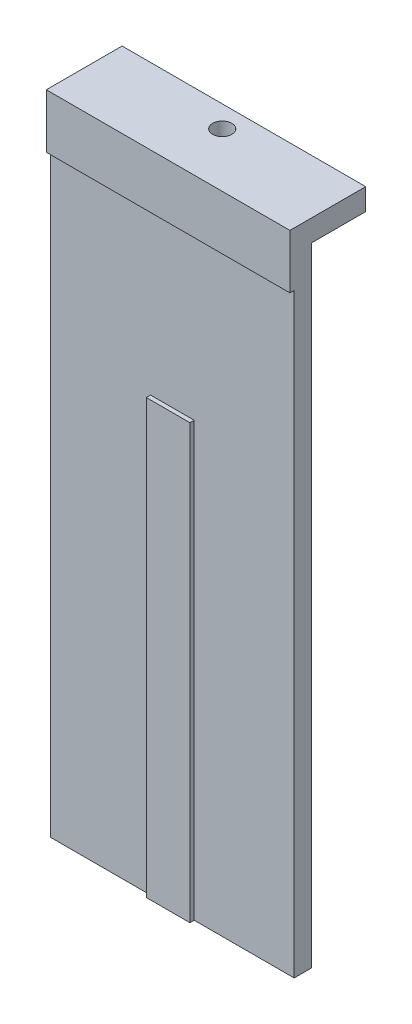
ISO-10303-21;
HEADER;
FILE_DESCRIPTION(('STEP AP214'),'2;1');
FILE_NAME('part.step','',(''),(''),'','','');
FILE_SCHEMA(('AUTOMOTIVE_DESIGN { 1 0 10303 214 1 1 1 1 }'));
ENDSEC;
DATA;
#1=APPLICATION_CONTEXT('core data for automotive mechanical design processes');
#2=APPLICATION_PROTOCOL_DEFINITION('international standard','automotive_design',2000,#1);
#3=PRODUCT_CONTEXT('',#1,'mechanical');
#4=PRODUCT('Part','Part','',(#3));
#5=PRODUCT_RELATED_PRODUCT_CATEGORY('part','',(#4));
#6=PRODUCT_DEFINITION_FORMATION('','',#4);
#7=PRODUCT_DEFINITION_CONTEXT('part definition',#1,'design');
#8=PRODUCT_DEFINITION('design','',#6,#7);
#9=PRODUCT_DEFINITION_SHAPE('','',#8);
#10=(LENGTH_UNIT() NAMED_UNIT(*) SI_UNIT(.MILLI.,.METRE.));
#11=(NAMED_UNIT(*) PLANE_ANGLE_UNIT() SI_UNIT($,.RADIAN.));
#12=(NAMED_UNIT(*) SI_UNIT($,.STERADIAN.) SOLID_ANGLE_UNIT());
#13=UNCERTAINTY_MEASURE_WITH_UNIT(LENGTH_MEASURE(1.E-05),#10,'distance_accuracy_value','');
#14=(GEOMETRIC_REPRESENTATION_CONTEXT(3) GLOBAL_UNCERTAINTY_ASSIGNED_CONTEXT((#13)) GLOBAL_UNIT_ASSIGNED_CONTEXT((#10,
#11,#12)) REPRESENTATION_CONTEXT('',''));
#15=CARTESIAN_POINT('',(0.,0.,0.));
#16=DIRECTION('',(0.,0.,1.));
#17=DIRECTION('',(1.,0.,0.));
#18=AXIS2_PLACEMENT_3D('',#15,#16,#17);
#19=CARTESIAN_POINT('',(-28.575,-152.4,2.54));
#20=DIRECTION('',(0.,0.,1.));
#21=DIRECTION('',(1.,0.,0.));
#22=AXIS2_PLACEMENT_3D('',#19,#20,#21);
#23=PLANE('',#22);
#24=DIRECTION('',(-1.,0.,0.));
#25=VECTOR('',#24,1.);
#26=CARTESIAN_POINT('',(28.575,-12.7,2.54));
#27=LINE('',#26,#25);
#28=CARTESIAN_POINT('',(28.575,-12.7,2.54));
#29=VERTEX_POINT('',#28);
#30=CARTESIAN_POINT('',(-28.575,-12.7,2.54));
#31=VERTEX_POINT('',#30);
#32=EDGE_CURVE('E177',#29,#31,#27,.T.);
#33=ORIENTED_EDGE('',*,*,#32,.F.);
#34=DIRECTION('',(0.,1.,0.));
#35=VECTOR('',#34,1.);
#36=CARTESIAN_POINT('',(28.575,-152.4,2.54));
#37=LINE('',#36,#35);
#38=CARTESIAN_POINT('',(28.575,0.,2.54));
#39=VERTEX_POINT('',#38);
#40=EDGE_CURVE('E11',#29,#39,#37,.T.);
#41=ORIENTED_EDGE('',*,*,#40,.T.);
#42=DIRECTION('',(1.,0.,0.));
#43=VECTOR('',#42,1.);
#44=CARTESIAN_POINT('',(-28.575,0.,2.54));
#45=LINE('',#44,#43);
#46=CARTESIAN_POINT('',(-28.575,0.,2.54));
#47=VERTEX_POINT('',#46);
#48=EDGE_CURVE('E234',#47,#39,#45,.T.);
#49=ORIENTED_EDGE('',*,*,#48,.F.);
#50=DIRECTION('',(0.,1.,0.));
#51=VECTOR('',#50,1.);
#52=CARTESIAN_POINT('',(-28.575,-152.4,2.54));
#53=LINE('',#52,#51);
#54=EDGE_CURVE('E53',#31,#47,#53,.T.);
#55=ORIENTED_EDGE('',*,*,#54,.F.);
#56=EDGE_LOOP('',(#33,#41,#49,#55));
#57=FACE_BOUND('',#56,.T.);
#58=ADVANCED_FACE('F43',(#57),#23,.T.);
#59=CARTESIAN_POINT('',(28.575,-152.4,2.54));
#60=DIRECTION('',(1.,0.,0.));
#61=DIRECTION('',(0.,0.,-1.));
#62=AXIS2_PLACEMENT_3D('',#59,#60,#61);
#63=PLANE('',#62);
#64=DIRECTION('',(0.,0.,1.));
#65=VECTOR('',#64,1.);
#66=CARTESIAN_POINT('',(28.575,-12.7,1.54));
#67=LINE('',#66,#65);
#68=CARTESIAN_POINT('',(28.575,-12.7,1.54));
#69=VERTEX_POINT('',#68);
#70=EDGE_CURVE('E215',#69,#29,#67,.T.);
#71=ORIENTED_EDGE('',*,*,#70,.F.);
#72=DIRECTION('',(0.,1.,0.));
#73=VECTOR('',#72,1.);
#74=CARTESIAN_POINT('',(28.575,-152.4,1.54));
#75=LINE('',#74,#73);
#76=CARTESIAN_POINT('',(28.575,-152.4,1.54));
#77=VERTEX_POINT('',#76);
#78=EDGE_CURVE('E192',#77,#69,#75,.T.);
#79=ORIENTED_EDGE('',*,*,#78,.F.);
#80=DIRECTION('',(0.,0.,-1.));
#81=VECTOR('',#80,1.);
#82=CARTESIAN_POINT('',(28.575,-152.4,2.54));
#83=LINE('',#82,#81);
#84=CARTESIAN_POINT('',(28.575,-152.4,-2.54));
#85=VERTEX_POINT('',#84);
#86=EDGE_CURVE('E230',#77,#85,#83,.T.);
#87=ORIENTED_EDGE('',*,*,#86,.T.);
#88=DIRECTION('',(0.,1.,0.));
#89=VECTOR('',#88,1.);
#90=CARTESIAN_POINT('',(28.575,-152.4,-2.54));
#91=LINE('',#90,#89);
#92=CARTESIAN_POINT('',(28.575,-5.08000000000006,-2.54));
#93=VERTEX_POINT('',#92);
#94=EDGE_CURVE('E161',#85,#93,#91,.T.);
#95=ORIENTED_EDGE('',*,*,#94,.T.);
#96=DIRECTION('',(0.,0.,1.));
#97=VECTOR('',#96,1.);
#98=CARTESIAN_POINT('',(28.575,-5.08,-15.24));
#99=LINE('',#98,#97);
#100=CARTESIAN_POINT('',(28.575,-5.08,-15.24));
#101=VERTEX_POINT('',#100);
#102=EDGE_CURVE('E141',#101,#93,#99,.T.);
#103=ORIENTED_EDGE('',*,*,#102,.F.);
#104=DIRECTION('',(0.,-1.,0.));
#105=VECTOR('',#104,1.);
#106=CARTESIAN_POINT('',(28.575,0.,-15.24));
#107=LINE('',#106,#105);
#108=CARTESIAN_POINT('',(28.575,0.,-15.24));
#109=VERTEX_POINT('',#108);
#110=EDGE_CURVE('E149',#109,#101,#107,.T.);
#111=ORIENTED_EDGE('',*,*,#110,.F.);
#112=DIRECTION('',(0.,0.,-1.));
#113=VECTOR('',#112,1.);
#114=CARTESIAN_POINT('',(28.575,0.,2.54));
#115=LINE('',#114,#113);
#116=EDGE_CURVE('E214',#39,#109,#115,.T.);
#117=ORIENTED_EDGE('',*,*,#116,.F.);
#118=ORIENTED_EDGE('',*,*,#40,.F.);
#119=EDGE_LOOP('',(#71,#79,#87,#95,#103,#111,#117,#118));
#120=FACE_BOUND('',#119,.T.);
#121=ADVANCED_FACE('F45',(#120),#63,.T.);
#122=DIRECTION('',(0.,-1.,0.));
#123=VECTOR('',#122,1.);
#124=CARTESIAN_POINT('',(5.12499999999998,-50.8,2.54));
#125=LINE('',#124,#123);
#126=CARTESIAN_POINT('',(5.12499999999998,-50.8,2.54));
#127=VERTEX_POINT('',#126);
#128=CARTESIAN_POINT('',(5.12500000000002,-152.4,2.54));
#129=VERTEX_POINT('',#128);
#130=EDGE_CURVE('E205',#127,#129,#125,.T.);
#131=ORIENTED_EDGE('',*,*,#130,.F.);
#132=DIRECTION('',(1.,0.,0.));
#133=VECTOR('',#132,1.);
#134=CARTESIAN_POINT('',(-5.12500000000002,-50.8,2.54));
#135=LINE('',#134,#133);
#136=CARTESIAN_POINT('',(-5.12500000000002,-50.8,2.54));
#137=VERTEX_POINT('',#136);
#138=EDGE_CURVE('E168',#137,#127,#135,.T.);
#139=ORIENTED_EDGE('',*,*,#138,.F.);
#140=DIRECTION('',(0.,1.,0.));
#141=VECTOR('',#140,1.);
#142=CARTESIAN_POINT('',(-5.12500000000002,-152.4,2.54));
#143=LINE('',#142,#141);
#144=CARTESIAN_POINT('',(-5.12500000000002,-152.4,2.54));
#145=VERTEX_POINT('',#144);
#146=EDGE_CURVE('E163',#145,#137,#143,.T.);
#147=ORIENTED_EDGE('',*,*,#146,.F.);
#148=DIRECTION('',(1.,0.,0.));
#149=VECTOR('',#148,1.);
#150=CARTESIAN_POINT('',(-28.575,-152.4,2.54));
#151=LINE('',#150,#149);
#152=EDGE_CURVE('E242',#145,#129,#151,.T.);
#153=ORIENTED_EDGE('',*,*,#152,.T.);
#154=EDGE_LOOP('',(#131,#139,#147,#153));
#155=FACE_BOUND('',#154,.T.);
#156=ADVANCED_FACE('F291',(#155),#23,.T.);
#157=CARTESIAN_POINT('',(-28.575,-152.4,2.54));
#158=DIRECTION('',(-1.,0.,0.));
#159=DIRECTION('',(0.,0.,1.));
#160=AXIS2_PLACEMENT_3D('',#157,#158,#159);
#161=PLANE('',#160);
#162=DIRECTION('',(0.,0.,1.));
#163=VECTOR('',#162,1.);
#164=CARTESIAN_POINT('',(-28.575,-12.7,1.54));
#165=LINE('',#164,#163);
#166=CARTESIAN_POINT('',(-28.575,-12.7,1.54));
#167=VERTEX_POINT('',#166);
#168=EDGE_CURVE('E210',#167,#31,#165,.T.);
#169=ORIENTED_EDGE('',*,*,#168,.T.);
#170=ORIENTED_EDGE('',*,*,#54,.T.);
#171=DIRECTION('',(0.,0.,1.));
#172=VECTOR('',#171,1.);
#173=CARTESIAN_POINT('',(-28.575,0.,2.54));
#174=LINE('',#173,#172);
#175=CARTESIAN_POINT('',(-28.575,0.,-15.24));
#176=VERTEX_POINT('',#175);
#177=EDGE_CURVE('E248',#176,#47,#174,.T.);
#178=ORIENTED_EDGE('',*,*,#177,.F.);
#179=DIRECTION('',(0.,1.,0.));
#180=VECTOR('',#179,1.);
#181=CARTESIAN_POINT('',(-28.575,0.,-15.24));
#182=LINE('',#181,#180);
#183=CARTESIAN_POINT('',(-28.575,-5.08,-15.24));
#184=VERTEX_POINT('',#183);
#185=EDGE_CURVE('E148',#184,#176,#182,.T.);
#186=ORIENTED_EDGE('',*,*,#185,.F.);
#187=DIRECTION('',(0.,0.,1.));
#188=VECTOR('',#187,1.);
#189=CARTESIAN_POINT('',(-28.575,-5.08,-15.24));
#190=LINE('',#189,#188);
#191=CARTESIAN_POINT('',(-28.575,-5.08,-2.54));
#192=VERTEX_POINT('',#191);
#193=EDGE_CURVE('E143',#184,#192,#190,.T.);
#194=ORIENTED_EDGE('',*,*,#193,.T.);
#195=DIRECTION('',(0.,1.,0.));
#196=VECTOR('',#195,1.);
#197=CARTESIAN_POINT('',(-28.575,-152.4,-2.54));
#198=LINE('',#197,#196);
#199=CARTESIAN_POINT('',(-28.575,-152.4,-2.54));
#200=VERTEX_POINT('',#199);
#201=EDGE_CURVE('E257',#200,#192,#198,.T.);
#202=ORIENTED_EDGE('',*,*,#201,.F.);
#203=DIRECTION('',(0.,0.,1.));
#204=VECTOR('',#203,1.);
#205=CARTESIAN_POINT('',(-28.575,-152.4,2.54));
#206=LINE('',#205,#204);
#207=CARTESIAN_POINT('',(-28.575,-152.4,1.54));
#208=VERTEX_POINT('',#207);
#209=EDGE_CURVE('E238',#200,#208,#206,.T.);
#210=ORIENTED_EDGE('',*,*,#209,.T.);
#211=DIRECTION('',(0.,-1.,0.));
#212=VECTOR('',#211,1.);
#213=CARTESIAN_POINT('',(-28.575,-12.7,1.54));
#214=LINE('',#213,#212);
#215=EDGE_CURVE('E69',#167,#208,#214,.T.);
#216=ORIENTED_EDGE('',*,*,#215,.F.);
#217=EDGE_LOOP('',(#169,#170,#178,#186,#194,#202,#210,#216));
#218=FACE_BOUND('',#217,.T.);
#219=ADVANCED_FACE('F265',(#218),#161,.T.);
#220=CARTESIAN_POINT('',(-28.575,-152.4,-2.54));
#221=DIRECTION('',(0.,0.,-1.));
#222=DIRECTION('',(-1.,0.,0.));
#223=AXIS2_PLACEMENT_3D('',#220,#221,#222);
#224=PLANE('',#223);
#225=DIRECTION('',(-1.,0.,0.));
#226=VECTOR('',#225,1.);
#227=CARTESIAN_POINT('',(28.575,-5.08,-2.54));
#228=LINE('',#227,#226);
#229=EDGE_CURVE('E61',#93,#192,#228,.T.);
#230=ORIENTED_EDGE('',*,*,#229,.F.);
#231=ORIENTED_EDGE('',*,*,#94,.F.);
#232=DIRECTION('',(-1.,0.,0.));
#233=VECTOR('',#232,1.);
#234=CARTESIAN_POINT('',(-28.575,-152.4,-2.54));
#235=LINE('',#234,#233);
#236=EDGE_CURVE('E233',#85,#200,#235,.T.);
#237=ORIENTED_EDGE('',*,*,#236,.T.);
#238=ORIENTED_EDGE('',*,*,#201,.T.);
#239=EDGE_LOOP('',(#230,#231,#237,#238));
#240=FACE_BOUND('',#239,.T.);
#241=ADVANCED_FACE('F260',(#240),#224,.T.);
#242=CARTESIAN_POINT('',(0.,-152.4,0.));
#243=DIRECTION('',(0.,-1.,0.));
#244=DIRECTION('',(0.,0.,-1.));
#245=AXIS2_PLACEMENT_3D('',#242,#243,#244);
#246=PLANE('',#245);
#247=DIRECTION('',(0.,0.,1.));
#248=VECTOR('',#247,1.);
#249=CARTESIAN_POINT('',(5.12500000000002,-152.4,1.54));
#250=LINE('',#249,#248);
#251=CARTESIAN_POINT('',(5.12500000000002,-152.4,1.54));
#252=VERTEX_POINT('',#251);
#253=EDGE_CURVE('E218',#252,#129,#250,.T.);
#254=ORIENTED_EDGE('',*,*,#253,.T.);
#255=ORIENTED_EDGE('',*,*,#152,.F.);
#256=DIRECTION('',(0.,0.,1.));
#257=VECTOR('',#256,1.);
#258=CARTESIAN_POINT('',(-5.12500000000002,-152.4,1.54));
#259=LINE('',#258,#257);
#260=CARTESIAN_POINT('',(-5.12500000000002,-152.4,1.54));
#261=VERTEX_POINT('',#260);
#262=EDGE_CURVE('E200',#261,#145,#259,.T.);
#263=ORIENTED_EDGE('',*,*,#262,.F.);
#264=DIRECTION('',(1.,0.,0.));
#265=VECTOR('',#264,1.);
#266=CARTESIAN_POINT('',(-28.575,-152.4,1.54));
#267=LINE('',#266,#265);
#268=EDGE_CURVE('E173',#208,#261,#267,.T.);
#269=ORIENTED_EDGE('',*,*,#268,.F.);
#270=ORIENTED_EDGE('',*,*,#209,.F.);
#271=ORIENTED_EDGE('',*,*,#236,.F.);
#272=ORIENTED_EDGE('',*,*,#86,.F.);
#273=DIRECTION('',(1.,0.,0.));
#274=VECTOR('',#273,1.);
#275=CARTESIAN_POINT('',(5.12500000000002,-152.4,1.54));
#276=LINE('',#275,#274);
#277=EDGE_CURVE('E189',#252,#77,#276,.T.);
#278=ORIENTED_EDGE('',*,*,#277,.F.);
#279=EDGE_LOOP('',(#254,#255,#263,#269,#270,#271,#272,#278));
#280=FACE_BOUND('',#279,.T.);
#281=ADVANCED_FACE('F312',(#280),#246,.T.);
#282=CARTESIAN_POINT('',(0.,0.,0.));
#283=DIRECTION('',(0.,-1.,0.));
#284=DIRECTION('',(0.,0.,-1.));
#285=AXIS2_PLACEMENT_3D('',#282,#283,#284);
#286=PLANE('',#285);
#287=CARTESIAN_POINT('',(0.,0.,-10.16));
#288=DIRECTION('',(0.,1.,0.));
#289=DIRECTION('',(0.,0.,1.));
#290=AXIS2_PLACEMENT_3D('',#287,#288,#289);
#291=CIRCLE('',#290,2.25);
#292=CARTESIAN_POINT('',(0.,0.,-7.91));
#293=VERTEX_POINT('',#292);
#294=EDGE_CURVE('E271',#293,#293,#291,.T.);
#295=ORIENTED_EDGE('',*,*,#294,.F.);
#296=EDGE_LOOP('',(#295));
#297=FACE_BOUND('',#296,.T.);
#298=ORIENTED_EDGE('',*,*,#116,.T.);
#299=DIRECTION('',(1.,0.,0.));
#300=VECTOR('',#299,1.);
#301=CARTESIAN_POINT('',(28.575,0.,-15.24));
#302=LINE('',#301,#300);
#303=EDGE_CURVE('E155',#176,#109,#302,.T.);
#304=ORIENTED_EDGE('',*,*,#303,.F.);
#305=ORIENTED_EDGE('',*,*,#177,.T.);
#306=ORIENTED_EDGE('',*,*,#48,.T.);
#307=EDGE_LOOP('',(#298,#304,#305,#306));
#308=FACE_BOUND('',#307,.T.);
#309=ADVANCED_FACE('F323',(#297,#308),#286,.F.);
#310=CARTESIAN_POINT('',(28.575,-12.7,1.54));
#311=DIRECTION('',(0.,1.,0.));
#312=DIRECTION('',(0.,0.,1.));
#313=AXIS2_PLACEMENT_3D('',#310,#311,#312);
#314=PLANE('',#313);
#315=ORIENTED_EDGE('',*,*,#32,.T.);
#316=ORIENTED_EDGE('',*,*,#168,.F.);
#317=DIRECTION('',(-1.,0.,0.));
#318=VECTOR('',#317,1.);
#319=CARTESIAN_POINT('',(28.575,-12.7,1.54));
#320=LINE('',#319,#318);
#321=EDGE_CURVE('E196',#69,#167,#320,.T.);
#322=ORIENTED_EDGE('',*,*,#321,.F.);
#323=ORIENTED_EDGE('',*,*,#70,.T.);
#324=EDGE_LOOP('',(#315,#316,#322,#323));
#325=FACE_BOUND('',#324,.T.);
#326=ADVANCED_FACE('F319',(#325),#314,.F.);
#327=CARTESIAN_POINT('',(5.12499999999998,-50.8,1.54));
#328=DIRECTION('',(-1.,0.,0.));
#329=DIRECTION('',(0.,-1.,0.));
#330=AXIS2_PLACEMENT_3D('',#327,#328,#329);
#331=PLANE('',#330);
#332=ORIENTED_EDGE('',*,*,#130,.T.);
#333=ORIENTED_EDGE('',*,*,#253,.F.);
#334=DIRECTION('',(0.,-1.,0.));
#335=VECTOR('',#334,1.);
#336=CARTESIAN_POINT('',(5.12499999999998,-50.8,1.54));
#337=LINE('',#336,#335);
#338=CARTESIAN_POINT('',(5.12499999999998,-50.8,1.54));
#339=VERTEX_POINT('',#338);
#340=EDGE_CURVE('E185',#339,#252,#337,.T.);
#341=ORIENTED_EDGE('',*,*,#340,.F.);
#342=DIRECTION('',(0.,0.,1.));
#343=VECTOR('',#342,1.);
#344=CARTESIAN_POINT('',(5.12499999999998,-50.8,1.54));
#345=LINE('',#344,#343);
#346=EDGE_CURVE('E222',#339,#127,#345,.T.);
#347=ORIENTED_EDGE('',*,*,#346,.T.);
#348=EDGE_LOOP('',(#332,#333,#341,#347));
#349=FACE_BOUND('',#348,.T.);
#350=ADVANCED_FACE('F308',(#349),#331,.F.);
#351=CARTESIAN_POINT('',(-5.12500000000002,-50.8,1.54));
#352=DIRECTION('',(0.,-1.,0.));
#353=DIRECTION('',(0.,0.,-1.));
#354=AXIS2_PLACEMENT_3D('',#351,#352,#353);
#355=PLANE('',#354);
#356=ORIENTED_EDGE('',*,*,#138,.T.);
#357=ORIENTED_EDGE('',*,*,#346,.F.);
#358=DIRECTION('',(1.,0.,0.));
#359=VECTOR('',#358,1.);
#360=CARTESIAN_POINT('',(-5.12500000000002,-50.8,1.54));
#361=LINE('',#360,#359);
#362=CARTESIAN_POINT('',(-5.12500000000002,-50.8,1.54));
#363=VERTEX_POINT('',#362);
#364=EDGE_CURVE('E181',#363,#339,#361,.T.);
#365=ORIENTED_EDGE('',*,*,#364,.F.);
#366=DIRECTION('',(0.,0.,1.));
#367=VECTOR('',#366,1.);
#368=CARTESIAN_POINT('',(-5.12500000000002,-50.8,1.54));
#369=LINE('',#368,#367);
#370=EDGE_CURVE('E225',#363,#137,#369,.T.);
#371=ORIENTED_EDGE('',*,*,#370,.T.);
#372=EDGE_LOOP('',(#356,#357,#365,#371));
#373=FACE_BOUND('',#372,.T.);
#374=ADVANCED_FACE('F336',(#373),#355,.F.);
#375=CARTESIAN_POINT('',(-5.12500000000002,-152.4,1.54));
#376=DIRECTION('',(1.,0.,0.));
#377=DIRECTION('',(0.,0.,-1.));
#378=AXIS2_PLACEMENT_3D('',#375,#376,#377);
#379=PLANE('',#378);
#380=ORIENTED_EDGE('',*,*,#146,.T.);
#381=ORIENTED_EDGE('',*,*,#370,.F.);
#382=DIRECTION('',(0.,1.,0.));
#383=VECTOR('',#382,1.);
#384=CARTESIAN_POINT('',(-5.12500000000002,-152.4,1.54));
#385=LINE('',#384,#383);
#386=EDGE_CURVE('E176',#261,#363,#385,.T.);
#387=ORIENTED_EDGE('',*,*,#386,.F.);
#388=ORIENTED_EDGE('',*,*,#262,.T.);
#389=EDGE_LOOP('',(#380,#381,#387,#388));
#390=FACE_BOUND('',#389,.T.);
#391=ADVANCED_FACE('F333',(#390),#379,.F.);
#392=CARTESIAN_POINT('',(0.,0.,1.54));
#393=DIRECTION('',(0.,0.,1.));
#394=DIRECTION('',(1.,0.,0.));
#395=AXIS2_PLACEMENT_3D('',#392,#393,#394);
#396=PLANE('',#395);
#397=ORIENTED_EDGE('',*,*,#268,.T.);
#398=ORIENTED_EDGE('',*,*,#386,.T.);
#399=ORIENTED_EDGE('',*,*,#364,.T.);
#400=ORIENTED_EDGE('',*,*,#340,.T.);
#401=ORIENTED_EDGE('',*,*,#277,.T.);
#402=ORIENTED_EDGE('',*,*,#78,.T.);
#403=ORIENTED_EDGE('',*,*,#321,.T.);
#404=ORIENTED_EDGE('',*,*,#215,.T.);
#405=EDGE_LOOP('',(#397,#398,#399,#400,#401,#402,#403,#404));
#406=FACE_BOUND('',#405,.T.);
#407=ADVANCED_FACE('F316',(#406),#396,.T.);
#408=CARTESIAN_POINT('',(28.575,-5.08,-15.24));
#409=DIRECTION('',(0.,1.,0.));
#410=DIRECTION('',(0.,0.,1.));
#411=AXIS2_PLACEMENT_3D('',#408,#409,#410);
#412=PLANE('',#411);
#413=CARTESIAN_POINT('',(0.,-5.08,-10.16));
#414=DIRECTION('',(0.,1.,0.));
#415=DIRECTION('',(0.,0.,1.));
#416=AXIS2_PLACEMENT_3D('',#413,#414,#415);
#417=CIRCLE('',#416,2.25);
#418=CARTESIAN_POINT('',(0.,-5.08,-7.91));
#419=VERTEX_POINT('',#418);
#420=EDGE_CURVE('E47',#419,#419,#417,.T.);
#421=ORIENTED_EDGE('',*,*,#420,.T.);
#422=EDGE_LOOP('',(#421));
#423=FACE_BOUND('',#422,.T.);
#424=ORIENTED_EDGE('',*,*,#229,.T.);
#425=ORIENTED_EDGE('',*,*,#193,.F.);
#426=DIRECTION('',(-1.,0.,0.));
#427=VECTOR('',#426,1.);
#428=CARTESIAN_POINT('',(28.575,-5.08,-15.24));
#429=LINE('',#428,#427);
#430=EDGE_CURVE('E137',#101,#184,#429,.T.);
#431=ORIENTED_EDGE('',*,*,#430,.F.);
#432=ORIENTED_EDGE('',*,*,#102,.T.);
#433=EDGE_LOOP('',(#424,#425,#431,#432));
#434=FACE_BOUND('',#433,.T.);
#435=ADVANCED_FACE('F139',(#423,#434),#412,.F.);
#436=CARTESIAN_POINT('',(0.,0.,-15.24));
#437=DIRECTION('',(0.,0.,-1.));
#438=DIRECTION('',(-1.,0.,0.));
#439=AXIS2_PLACEMENT_3D('',#436,#437,#438);
#440=PLANE('',#439);
#441=ORIENTED_EDGE('',*,*,#110,.T.);
#442=ORIENTED_EDGE('',*,*,#430,.T.);
#443=ORIENTED_EDGE('',*,*,#185,.T.);
#444=ORIENTED_EDGE('',*,*,#303,.T.);
#445=EDGE_LOOP('',(#441,#442,#443,#444));
#446=FACE_BOUND('',#445,.T.);
#447=ADVANCED_FACE('F153',(#446),#440,.T.);
#448=CARTESIAN_POINT('',(0.,-12.7,-10.16));
#449=DIRECTION('',(0.,1.,0.));
#450=DIRECTION('',(0.,0.,1.));
#451=AXIS2_PLACEMENT_3D('',#448,#449,#450);
#452=CYLINDRICAL_SURFACE('',#451,2.25);
#453=ORIENTED_EDGE('',*,*,#294,.T.);
#454=EDGE_LOOP('',(#453));
#455=FACE_BOUND('',#454,.T.);
#456=ORIENTED_EDGE('',*,*,#420,.F.);
#457=EDGE_LOOP('',(#456));
#458=FACE_BOUND('',#457,.T.);
#459=ADVANCED_FACE('F281',(#455,#458),#452,.F.);
#460=CLOSED_SHELL('',(#58,#121,#156,#219,#241,#281,#309,#326,#350,#374,#391,#407,#435,#447,#459));
#461=MANIFOLD_SOLID_BREP('B2',#460);
#462=ADVANCED_BREP_SHAPE_REPRESENTATION('',(#18,#461),#14);
#463=SHAPE_DEFINITION_REPRESENTATION(#9,#462);
ENDSEC;
END-ISO-10303-21;
